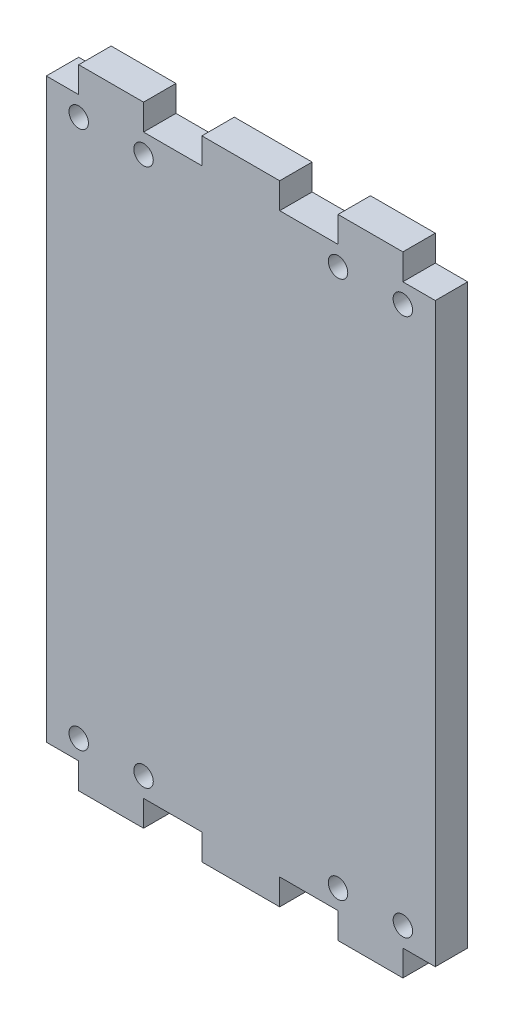
ISO-10303-21;
HEADER;
FILE_DESCRIPTION(('STEP AP214'),'2;1');
FILE_NAME('part.step','',(''),(''),'','','');
FILE_SCHEMA(('AUTOMOTIVE_DESIGN { 1 0 10303 214 1 1 1 1 }'));
ENDSEC;
DATA;
#1=APPLICATION_CONTEXT('core data for automotive mechanical design processes');
#2=APPLICATION_PROTOCOL_DEFINITION('international standard','automotive_design',2000,#1);
#3=PRODUCT_CONTEXT('',#1,'mechanical');
#4=PRODUCT('Part','Part','',(#3));
#5=PRODUCT_RELATED_PRODUCT_CATEGORY('part','',(#4));
#6=PRODUCT_DEFINITION_FORMATION('','',#4);
#7=PRODUCT_DEFINITION_CONTEXT('part definition',#1,'design');
#8=PRODUCT_DEFINITION('design','',#6,#7);
#9=PRODUCT_DEFINITION_SHAPE('','',#8);
#10=(LENGTH_UNIT() NAMED_UNIT(*) SI_UNIT(.MILLI.,.METRE.));
#11=(NAMED_UNIT(*) PLANE_ANGLE_UNIT() SI_UNIT($,.RADIAN.));
#12=(NAMED_UNIT(*) SI_UNIT($,.STERADIAN.) SOLID_ANGLE_UNIT());
#13=UNCERTAINTY_MEASURE_WITH_UNIT(LENGTH_MEASURE(1.E-05),#10,'distance_accuracy_value','');
#14=(GEOMETRIC_REPRESENTATION_CONTEXT(3) GLOBAL_UNCERTAINTY_ASSIGNED_CONTEXT((#13)) GLOBAL_UNIT_ASSIGNED_CONTEXT((#10,
#11,#12)) REPRESENTATION_CONTEXT('',''));
#15=CARTESIAN_POINT('',(0.,0.,0.));
#16=DIRECTION('',(0.,0.,1.));
#17=DIRECTION('',(1.,0.,0.));
#18=AXIS2_PLACEMENT_3D('',#15,#16,#17);
#19=CARTESIAN_POINT('',(30.,48.5,5.));
#20=DIRECTION('',(-1.,0.,0.));
#21=DIRECTION('',(0.,-1.,0.));
#22=AXIS2_PLACEMENT_3D('',#19,#20,#21);
#23=PLANE('',#22);
#24=DIRECTION('',(0.,0.,1.));
#25=VECTOR('',#24,1.);
#26=CARTESIAN_POINT('',(30.,44.5,-5.));
#27=LINE('',#26,#25);
#28=CARTESIAN_POINT('',(30.,44.5,0.));
#29=VERTEX_POINT('',#28);
#30=CARTESIAN_POINT('',(30.,44.5,5.));
#31=VERTEX_POINT('',#30);
#32=EDGE_CURVE('E322',#29,#31,#27,.T.);
#33=ORIENTED_EDGE('',*,*,#32,.T.);
#34=DIRECTION('',(0.,1.,0.));
#35=VECTOR('',#34,1.);
#36=CARTESIAN_POINT('',(30.,48.5,5.));
#37=LINE('',#36,#35);
#38=CARTESIAN_POINT('',(30.,-44.5,5.));
#39=VERTEX_POINT('',#38);
#40=EDGE_CURVE('E364',#39,#31,#37,.T.);
#41=ORIENTED_EDGE('',*,*,#40,.F.);
#42=DIRECTION('',(0.,0.,1.));
#43=VECTOR('',#42,1.);
#44=CARTESIAN_POINT('',(30.,-44.5,-5.));
#45=LINE('',#44,#43);
#46=CARTESIAN_POINT('',(30.,-44.5,0.));
#47=VERTEX_POINT('',#46);
#48=EDGE_CURVE('E325',#47,#39,#45,.T.);
#49=ORIENTED_EDGE('',*,*,#48,.F.);
#50=DIRECTION('',(0.,1.,0.));
#51=VECTOR('',#50,1.);
#52=CARTESIAN_POINT('',(30.,48.5,0.));
#53=LINE('',#52,#51);
#54=EDGE_CURVE('E308',#47,#29,#53,.T.);
#55=ORIENTED_EDGE('',*,*,#54,.T.);
#56=EDGE_LOOP('',(#33,#41,#49,#55));
#57=FACE_BOUND('',#56,.T.);
#58=ADVANCED_FACE('F44',(#57),#23,.F.);
#59=CARTESIAN_POINT('',(-30.,48.5,5.));
#60=DIRECTION('',(0.,-1.,0.));
#61=DIRECTION('',(0.,0.,-1.));
#62=AXIS2_PLACEMENT_3D('',#59,#60,#61);
#63=PLANE('',#62);
#64=DIRECTION('',(0.,0.,1.));
#65=VECTOR('',#64,1.);
#66=CARTESIAN_POINT('',(-6.,48.5,-5.));
#67=LINE('',#66,#65);
#68=CARTESIAN_POINT('',(-6.,48.5,0.));
#69=VERTEX_POINT('',#68);
#70=CARTESIAN_POINT('',(-6.,48.5,5.));
#71=VERTEX_POINT('',#70);
#72=EDGE_CURVE('E305',#69,#71,#67,.T.);
#73=ORIENTED_EDGE('',*,*,#72,.T.);
#74=DIRECTION('',(-1.,0.,0.));
#75=VECTOR('',#74,1.);
#76=CARTESIAN_POINT('',(-30.,48.5,5.));
#77=LINE('',#76,#75);
#78=CARTESIAN_POINT('',(6.,48.5,5.));
#79=VERTEX_POINT('',#78);
#80=EDGE_CURVE('E370',#79,#71,#77,.T.);
#81=ORIENTED_EDGE('',*,*,#80,.F.);
#82=DIRECTION('',(0.,0.,1.));
#83=VECTOR('',#82,1.);
#84=CARTESIAN_POINT('',(6.,48.5,-5.));
#85=LINE('',#84,#83);
#86=CARTESIAN_POINT('',(6.,48.5,0.));
#87=VERTEX_POINT('',#86);
#88=EDGE_CURVE('E309',#87,#79,#85,.T.);
#89=ORIENTED_EDGE('',*,*,#88,.F.);
#90=DIRECTION('',(-1.,0.,0.));
#91=VECTOR('',#90,1.);
#92=CARTESIAN_POINT('',(-30.,48.5,0.));
#93=LINE('',#92,#91);
#94=EDGE_CURVE('E385',#87,#69,#93,.T.);
#95=ORIENTED_EDGE('',*,*,#94,.T.);
#96=EDGE_LOOP('',(#73,#81,#89,#95));
#97=FACE_BOUND('',#96,.T.);
#98=ADVANCED_FACE('F471',(#97),#63,.F.);
#99=DIRECTION('',(0.,0.,1.));
#100=VECTOR('',#99,1.);
#101=CARTESIAN_POINT('',(15.,48.5,-5.));
#102=LINE('',#101,#100);
#103=CARTESIAN_POINT('',(15.,48.5,0.));
#104=VERTEX_POINT('',#103);
#105=CARTESIAN_POINT('',(15.,48.5,5.));
#106=VERTEX_POINT('',#105);
#107=EDGE_CURVE('E315',#104,#106,#102,.T.);
#108=ORIENTED_EDGE('',*,*,#107,.T.);
#109=CARTESIAN_POINT('',(25.,48.5,5.));
#110=VERTEX_POINT('',#109);
#111=EDGE_CURVE('E371',#110,#106,#77,.T.);
#112=ORIENTED_EDGE('',*,*,#111,.F.);
#113=DIRECTION('',(0.,0.,1.));
#114=VECTOR('',#113,1.);
#115=CARTESIAN_POINT('',(25.,48.5,-5.));
#116=LINE('',#115,#114);
#117=CARTESIAN_POINT('',(25.,48.5,0.));
#118=VERTEX_POINT('',#117);
#119=EDGE_CURVE('E318',#118,#110,#116,.T.);
#120=ORIENTED_EDGE('',*,*,#119,.F.);
#121=EDGE_CURVE('E386',#118,#104,#93,.T.);
#122=ORIENTED_EDGE('',*,*,#121,.T.);
#123=EDGE_LOOP('',(#108,#112,#120,#122));
#124=FACE_BOUND('',#123,.T.);
#125=ADVANCED_FACE('F476',(#124),#63,.F.);
#126=DIRECTION('',(0.,0.,1.));
#127=VECTOR('',#126,1.);
#128=CARTESIAN_POINT('',(-25.,48.5,-5.));
#129=LINE('',#128,#127);
#130=CARTESIAN_POINT('',(-25.,48.5,0.));
#131=VERTEX_POINT('',#130);
#132=CARTESIAN_POINT('',(-25.,48.5,5.));
#133=VERTEX_POINT('',#132);
#134=EDGE_CURVE('E68',#131,#133,#129,.T.);
#135=ORIENTED_EDGE('',*,*,#134,.T.);
#136=CARTESIAN_POINT('',(-15.,48.5,5.));
#137=VERTEX_POINT('',#136);
#138=EDGE_CURVE('E367',#137,#133,#77,.T.);
#139=ORIENTED_EDGE('',*,*,#138,.F.);
#140=DIRECTION('',(0.,0.,1.));
#141=VECTOR('',#140,1.);
#142=CARTESIAN_POINT('',(-15.,48.5,-5.));
#143=LINE('',#142,#141);
#144=CARTESIAN_POINT('',(-15.,48.5,0.));
#145=VERTEX_POINT('',#144);
#146=EDGE_CURVE('E237',#145,#137,#143,.T.);
#147=ORIENTED_EDGE('',*,*,#146,.F.);
#148=EDGE_CURVE('E382',#145,#131,#93,.T.);
#149=ORIENTED_EDGE('',*,*,#148,.T.);
#150=EDGE_LOOP('',(#135,#139,#147,#149));
#151=FACE_BOUND('',#150,.T.);
#152=ADVANCED_FACE('F478',(#151),#63,.F.);
#153=CARTESIAN_POINT('',(-30.,48.5,5.));
#154=DIRECTION('',(1.,0.,0.));
#155=DIRECTION('',(0.,1.,0.));
#156=AXIS2_PLACEMENT_3D('',#153,#154,#155);
#157=PLANE('',#156);
#158=DIRECTION('',(0.,0.,1.));
#159=VECTOR('',#158,1.);
#160=CARTESIAN_POINT('',(-30.,-44.5,-5.));
#161=LINE('',#160,#159);
#162=CARTESIAN_POINT('',(-30.,-44.5,0.));
#163=VERTEX_POINT('',#162);
#164=CARTESIAN_POINT('',(-30.,-44.5,5.));
#165=VERTEX_POINT('',#164);
#166=EDGE_CURVE('E354',#163,#165,#161,.T.);
#167=ORIENTED_EDGE('',*,*,#166,.T.);
#168=DIRECTION('',(0.,-1.,0.));
#169=VECTOR('',#168,1.);
#170=CARTESIAN_POINT('',(-30.,48.5,5.));
#171=LINE('',#170,#169);
#172=CARTESIAN_POINT('',(-30.,44.5,5.));
#173=VERTEX_POINT('',#172);
#174=EDGE_CURVE('E372',#173,#165,#171,.T.);
#175=ORIENTED_EDGE('',*,*,#174,.F.);
#176=DIRECTION('',(0.,0.,1.));
#177=VECTOR('',#176,1.);
#178=CARTESIAN_POINT('',(-30.,44.5,-5.));
#179=LINE('',#178,#177);
#180=CARTESIAN_POINT('',(-30.,44.5,0.));
#181=VERTEX_POINT('',#180);
#182=EDGE_CURVE('E357',#181,#173,#179,.T.);
#183=ORIENTED_EDGE('',*,*,#182,.F.);
#184=DIRECTION('',(0.,-1.,0.));
#185=VECTOR('',#184,1.);
#186=CARTESIAN_POINT('',(-30.,48.5,0.));
#187=LINE('',#186,#185);
#188=EDGE_CURVE('E387',#181,#163,#187,.T.);
#189=ORIENTED_EDGE('',*,*,#188,.T.);
#190=EDGE_LOOP('',(#167,#175,#183,#189));
#191=FACE_BOUND('',#190,.T.);
#192=ADVANCED_FACE('F524',(#191),#157,.F.);
#193=CARTESIAN_POINT('',(-30.,-48.5,5.));
#194=DIRECTION('',(0.,1.,0.));
#195=DIRECTION('',(0.,0.,1.));
#196=AXIS2_PLACEMENT_3D('',#193,#194,#195);
#197=PLANE('',#196);
#198=DIRECTION('',(0.,0.,1.));
#199=VECTOR('',#198,1.);
#200=CARTESIAN_POINT('',(25.,-48.5,-5.));
#201=LINE('',#200,#199);
#202=CARTESIAN_POINT('',(25.,-48.5,0.));
#203=VERTEX_POINT('',#202);
#204=CARTESIAN_POINT('',(25.,-48.5,5.));
#205=VERTEX_POINT('',#204);
#206=EDGE_CURVE('E329',#203,#205,#201,.T.);
#207=ORIENTED_EDGE('',*,*,#206,.T.);
#208=DIRECTION('',(1.,0.,0.));
#209=VECTOR('',#208,1.);
#210=CARTESIAN_POINT('',(-30.,-48.5,5.));
#211=LINE('',#210,#209);
#212=CARTESIAN_POINT('',(15.,-48.5,5.));
#213=VERTEX_POINT('',#212);
#214=EDGE_CURVE('E375',#213,#205,#211,.T.);
#215=ORIENTED_EDGE('',*,*,#214,.F.);
#216=DIRECTION('',(0.,0.,1.));
#217=VECTOR('',#216,1.);
#218=CARTESIAN_POINT('',(15.,-48.5,-5.));
#219=LINE('',#218,#217);
#220=CARTESIAN_POINT('',(15.,-48.5,0.));
#221=VERTEX_POINT('',#220);
#222=EDGE_CURVE('E332',#221,#213,#219,.T.);
#223=ORIENTED_EDGE('',*,*,#222,.F.);
#224=DIRECTION('',(1.,0.,0.));
#225=VECTOR('',#224,1.);
#226=CARTESIAN_POINT('',(-30.,-48.5,0.));
#227=LINE('',#226,#225);
#228=EDGE_CURVE('E390',#221,#203,#227,.T.);
#229=ORIENTED_EDGE('',*,*,#228,.T.);
#230=EDGE_LOOP('',(#207,#215,#223,#229));
#231=FACE_BOUND('',#230,.T.);
#232=ADVANCED_FACE('F566',(#231),#197,.F.);
#233=DIRECTION('',(0.,0.,1.));
#234=VECTOR('',#233,1.);
#235=CARTESIAN_POINT('',(6.,-48.5,-5.));
#236=LINE('',#235,#234);
#237=CARTESIAN_POINT('',(6.,-48.5,0.));
#238=VERTEX_POINT('',#237);
#239=CARTESIAN_POINT('',(6.,-48.5,5.));
#240=VERTEX_POINT('',#239);
#241=EDGE_CURVE('E338',#238,#240,#236,.T.);
#242=ORIENTED_EDGE('',*,*,#241,.T.);
#243=CARTESIAN_POINT('',(-6.,-48.5,5.));
#244=VERTEX_POINT('',#243);
#245=EDGE_CURVE('E378',#244,#240,#211,.T.);
#246=ORIENTED_EDGE('',*,*,#245,.F.);
#247=DIRECTION('',(0.,0.,1.));
#248=VECTOR('',#247,1.);
#249=CARTESIAN_POINT('',(-6.,-48.5,-5.));
#250=LINE('',#249,#248);
#251=CARTESIAN_POINT('',(-6.,-48.5,0.));
#252=VERTEX_POINT('',#251);
#253=EDGE_CURVE('E341',#252,#244,#250,.T.);
#254=ORIENTED_EDGE('',*,*,#253,.F.);
#255=EDGE_CURVE('E393',#252,#238,#227,.T.);
#256=ORIENTED_EDGE('',*,*,#255,.T.);
#257=EDGE_LOOP('',(#242,#246,#254,#256));
#258=FACE_BOUND('',#257,.T.);
#259=ADVANCED_FACE('F545',(#258),#197,.F.);
#260=DIRECTION('',(0.,0.,1.));
#261=VECTOR('',#260,1.);
#262=CARTESIAN_POINT('',(-15.,-48.5,-5.));
#263=LINE('',#262,#261);
#264=CARTESIAN_POINT('',(-15.,-48.5,0.));
#265=VERTEX_POINT('',#264);
#266=CARTESIAN_POINT('',(-15.,-48.5,5.));
#267=VERTEX_POINT('',#266);
#268=EDGE_CURVE('E347',#265,#267,#263,.T.);
#269=ORIENTED_EDGE('',*,*,#268,.T.);
#270=CARTESIAN_POINT('',(-25.,-48.5,5.));
#271=VERTEX_POINT('',#270);
#272=EDGE_CURVE('E379',#271,#267,#211,.T.);
#273=ORIENTED_EDGE('',*,*,#272,.F.);
#274=DIRECTION('',(0.,0.,1.));
#275=VECTOR('',#274,1.);
#276=CARTESIAN_POINT('',(-25.,-48.5,-5.));
#277=LINE('',#276,#275);
#278=CARTESIAN_POINT('',(-25.,-48.5,0.));
#279=VERTEX_POINT('',#278);
#280=EDGE_CURVE('E350',#279,#271,#277,.T.);
#281=ORIENTED_EDGE('',*,*,#280,.F.);
#282=EDGE_CURVE('E368',#279,#265,#227,.T.);
#283=ORIENTED_EDGE('',*,*,#282,.T.);
#284=EDGE_LOOP('',(#269,#273,#281,#283));
#285=FACE_BOUND('',#284,.T.);
#286=ADVANCED_FACE('F538',(#285),#197,.F.);
#287=CARTESIAN_POINT('',(0.,0.,5.));
#288=DIRECTION('',(0.,0.,1.));
#289=DIRECTION('',(1.,0.,0.));
#290=AXIS2_PLACEMENT_3D('',#287,#288,#289);
#291=PLANE('',#290);
#292=CARTESIAN_POINT('',(-15.0000012437886,41.5049875614917,5.));
#293=DIRECTION('',(0.,0.,1.));
#294=DIRECTION('',(1.,0.,0.));
#295=AXIS2_PLACEMENT_3D('',#292,#293,#294);
#296=CIRCLE('',#295,1.5);
#297=CARTESIAN_POINT('',(-13.5000012437886,41.5049875614917,5.));
#298=VERTEX_POINT('',#297);
#299=EDGE_CURVE('E906',#298,#298,#296,.T.);
#300=ORIENTED_EDGE('',*,*,#299,.F.);
#301=EDGE_LOOP('',(#300));
#302=FACE_BOUND('',#301,.T.);
#303=CARTESIAN_POINT('',(15.0000012437886,41.5049875614917,5.));
#304=DIRECTION('',(0.,0.,1.));
#305=DIRECTION('',(-1.,0.,0.));
#306=AXIS2_PLACEMENT_3D('',#303,#304,#305);
#307=CIRCLE('',#306,1.5);
#308=CARTESIAN_POINT('',(13.5000012437886,41.5049875614917,5.));
#309=VERTEX_POINT('',#308);
#310=EDGE_CURVE('E902',#309,#309,#307,.T.);
#311=ORIENTED_EDGE('',*,*,#310,.F.);
#312=EDGE_LOOP('',(#311));
#313=FACE_BOUND('',#312,.T.);
#314=CARTESIAN_POINT('',(25.,41.5,5.));
#315=DIRECTION('',(0.,0.,1.));
#316=DIRECTION('',(-1.,0.,0.));
#317=AXIS2_PLACEMENT_3D('',#314,#315,#316);
#318=CIRCLE('',#317,1.5);
#319=CARTESIAN_POINT('',(23.5,41.5,5.));
#320=VERTEX_POINT('',#319);
#321=EDGE_CURVE('E883',#320,#320,#318,.T.);
#322=ORIENTED_EDGE('',*,*,#321,.F.);
#323=EDGE_LOOP('',(#322));
#324=FACE_BOUND('',#323,.T.);
#325=CARTESIAN_POINT('',(25.,-41.5,5.));
#326=DIRECTION('',(0.,0.,1.));
#327=DIRECTION('',(1.,0.,0.));
#328=AXIS2_PLACEMENT_3D('',#325,#326,#327);
#329=CIRCLE('',#328,1.5);
#330=CARTESIAN_POINT('',(26.5,-41.5,5.));
#331=VERTEX_POINT('',#330);
#332=EDGE_CURVE('E903',#331,#331,#329,.T.);
#333=ORIENTED_EDGE('',*,*,#332,.F.);
#334=EDGE_LOOP('',(#333));
#335=FACE_BOUND('',#334,.T.);
#336=CARTESIAN_POINT('',(15.0000012437886,-41.5049875614917,5.));
#337=DIRECTION('',(0.,0.,1.));
#338=DIRECTION('',(1.,0.,0.));
#339=AXIS2_PLACEMENT_3D('',#336,#337,#338);
#340=CIRCLE('',#339,1.5);
#341=CARTESIAN_POINT('',(16.5000012437886,-41.5049875614917,5.));
#342=VERTEX_POINT('',#341);
#343=EDGE_CURVE('E909',#342,#342,#340,.T.);
#344=ORIENTED_EDGE('',*,*,#343,.F.);
#345=EDGE_LOOP('',(#344));
#346=FACE_BOUND('',#345,.T.);
#347=CARTESIAN_POINT('',(-15.0000012437886,-41.5049875614917,5.));
#348=DIRECTION('',(0.,0.,1.));
#349=DIRECTION('',(-1.,0.,0.));
#350=AXIS2_PLACEMENT_3D('',#347,#348,#349);
#351=CIRCLE('',#350,1.5);
#352=CARTESIAN_POINT('',(-16.5000012437886,-41.5049875614917,5.));
#353=VERTEX_POINT('',#352);
#354=EDGE_CURVE('E919',#353,#353,#351,.T.);
#355=ORIENTED_EDGE('',*,*,#354,.F.);
#356=EDGE_LOOP('',(#355));
#357=FACE_BOUND('',#356,.T.);
#358=CARTESIAN_POINT('',(-25.,-41.5,5.));
#359=DIRECTION('',(0.,0.,1.));
#360=DIRECTION('',(-1.,0.,0.));
#361=AXIS2_PLACEMENT_3D('',#358,#359,#360);
#362=CIRCLE('',#361,1.5);
#363=CARTESIAN_POINT('',(-26.5,-41.5,5.));
#364=VERTEX_POINT('',#363);
#365=EDGE_CURVE('E916',#364,#364,#362,.T.);
#366=ORIENTED_EDGE('',*,*,#365,.F.);
#367=EDGE_LOOP('',(#366));
#368=FACE_BOUND('',#367,.T.);
#369=CARTESIAN_POINT('',(-25.,41.5,5.));
#370=DIRECTION('',(0.,0.,1.));
#371=DIRECTION('',(1.,0.,0.));
#372=AXIS2_PLACEMENT_3D('',#369,#370,#371);
#373=CIRCLE('',#372,1.5);
#374=CARTESIAN_POINT('',(-23.5,41.5,5.));
#375=VERTEX_POINT('',#374);
#376=EDGE_CURVE('E434',#375,#375,#373,.T.);
#377=ORIENTED_EDGE('',*,*,#376,.F.);
#378=EDGE_LOOP('',(#377));
#379=FACE_BOUND('',#378,.T.);
#380=DIRECTION('',(-1.,0.,0.));
#381=VECTOR('',#380,1.);
#382=CARTESIAN_POINT('',(6.,44.5,5.));
#383=LINE('',#382,#381);
#384=CARTESIAN_POINT('',(15.,44.5,5.));
#385=VERTEX_POINT('',#384);
#386=CARTESIAN_POINT('',(6.,44.5,5.));
#387=VERTEX_POINT('',#386);
#388=EDGE_CURVE('E300',#385,#387,#383,.T.);
#389=ORIENTED_EDGE('',*,*,#388,.T.);
#390=DIRECTION('',(0.,1.,0.));
#391=VECTOR('',#390,1.);
#392=CARTESIAN_POINT('',(6.,44.5,5.));
#393=LINE('',#392,#391);
#394=EDGE_CURVE('E302',#387,#79,#393,.T.);
#395=ORIENTED_EDGE('',*,*,#394,.T.);
#396=ORIENTED_EDGE('',*,*,#80,.T.);
#397=DIRECTION('',(0.,-1.,0.));
#398=VECTOR('',#397,1.);
#399=CARTESIAN_POINT('',(-6.,48.5,5.));
#400=LINE('',#399,#398);
#401=CARTESIAN_POINT('',(-6.,44.5,5.));
#402=VERTEX_POINT('',#401);
#403=EDGE_CURVE('E251',#71,#402,#400,.T.);
#404=ORIENTED_EDGE('',*,*,#403,.T.);
#405=DIRECTION('',(-1.,0.,0.));
#406=VECTOR('',#405,1.);
#407=CARTESIAN_POINT('',(-6.,44.5,5.));
#408=LINE('',#407,#406);
#409=CARTESIAN_POINT('',(-15.,44.5,5.));
#410=VERTEX_POINT('',#409);
#411=EDGE_CURVE('E231',#402,#410,#408,.T.);
#412=ORIENTED_EDGE('',*,*,#411,.T.);
#413=DIRECTION('',(0.,1.,0.));
#414=VECTOR('',#413,1.);
#415=CARTESIAN_POINT('',(-15.,44.5,5.));
#416=LINE('',#415,#414);
#417=EDGE_CURVE('E240',#410,#137,#416,.T.);
#418=ORIENTED_EDGE('',*,*,#417,.T.);
#419=ORIENTED_EDGE('',*,*,#138,.T.);
#420=DIRECTION('',(0.,-1.,0.));
#421=VECTOR('',#420,1.);
#422=CARTESIAN_POINT('',(-25.,48.5,5.));
#423=LINE('',#422,#421);
#424=CARTESIAN_POINT('',(-25.,44.5,5.));
#425=VERTEX_POINT('',#424);
#426=EDGE_CURVE('E246',#133,#425,#423,.T.);
#427=ORIENTED_EDGE('',*,*,#426,.T.);
#428=DIRECTION('',(-1.,0.,0.));
#429=VECTOR('',#428,1.);
#430=CARTESIAN_POINT('',(-25.,44.5,5.));
#431=LINE('',#430,#429);
#432=EDGE_CURVE('E258',#425,#173,#431,.T.);
#433=ORIENTED_EDGE('',*,*,#432,.T.);
#434=ORIENTED_EDGE('',*,*,#174,.T.);
#435=DIRECTION('',(1.,0.,0.));
#436=VECTOR('',#435,1.);
#437=CARTESIAN_POINT('',(-25.,-44.5,5.));
#438=LINE('',#437,#436);
#439=CARTESIAN_POINT('',(-25.,-44.5,5.));
#440=VERTEX_POINT('',#439);
#441=EDGE_CURVE('E261',#165,#440,#438,.T.);
#442=ORIENTED_EDGE('',*,*,#441,.T.);
#443=DIRECTION('',(0.,-1.,0.));
#444=VECTOR('',#443,1.);
#445=CARTESIAN_POINT('',(-25.,-48.5,5.));
#446=LINE('',#445,#444);
#447=EDGE_CURVE('E264',#440,#271,#446,.T.);
#448=ORIENTED_EDGE('',*,*,#447,.T.);
#449=ORIENTED_EDGE('',*,*,#272,.T.);
#450=DIRECTION('',(0.,1.,0.));
#451=VECTOR('',#450,1.);
#452=CARTESIAN_POINT('',(-15.,-44.5,5.));
#453=LINE('',#452,#451);
#454=CARTESIAN_POINT('',(-15.,-44.5,5.));
#455=VERTEX_POINT('',#454);
#456=EDGE_CURVE('E267',#267,#455,#453,.T.);
#457=ORIENTED_EDGE('',*,*,#456,.T.);
#458=DIRECTION('',(1.,0.,0.));
#459=VECTOR('',#458,1.);
#460=CARTESIAN_POINT('',(-6.,-44.5,5.));
#461=LINE('',#460,#459);
#462=CARTESIAN_POINT('',(-6.,-44.5,5.));
#463=VERTEX_POINT('',#462);
#464=EDGE_CURVE('E270',#455,#463,#461,.T.);
#465=ORIENTED_EDGE('',*,*,#464,.T.);
#466=DIRECTION('',(0.,-1.,0.));
#467=VECTOR('',#466,1.);
#468=CARTESIAN_POINT('',(-6.,-48.5,5.));
#469=LINE('',#468,#467);
#470=EDGE_CURVE('E273',#463,#244,#469,.T.);
#471=ORIENTED_EDGE('',*,*,#470,.T.);
#472=ORIENTED_EDGE('',*,*,#245,.T.);
#473=DIRECTION('',(0.,1.,0.));
#474=VECTOR('',#473,1.);
#475=CARTESIAN_POINT('',(6.,-44.5,5.));
#476=LINE('',#475,#474);
#477=CARTESIAN_POINT('',(6.,-44.5,5.));
#478=VERTEX_POINT('',#477);
#479=EDGE_CURVE('E276',#240,#478,#476,.T.);
#480=ORIENTED_EDGE('',*,*,#479,.T.);
#481=DIRECTION('',(1.,0.,0.));
#482=VECTOR('',#481,1.);
#483=CARTESIAN_POINT('',(6.,-44.5,5.));
#484=LINE('',#483,#482);
#485=CARTESIAN_POINT('',(15.,-44.5,5.));
#486=VERTEX_POINT('',#485);
#487=EDGE_CURVE('E279',#478,#486,#484,.T.);
#488=ORIENTED_EDGE('',*,*,#487,.T.);
#489=DIRECTION('',(0.,-1.,0.));
#490=VECTOR('',#489,1.);
#491=CARTESIAN_POINT('',(15.,-44.5,5.));
#492=LINE('',#491,#490);
#493=EDGE_CURVE('E282',#486,#213,#492,.T.);
#494=ORIENTED_EDGE('',*,*,#493,.T.);
#495=ORIENTED_EDGE('',*,*,#214,.T.);
#496=DIRECTION('',(0.,1.,0.));
#497=VECTOR('',#496,1.);
#498=CARTESIAN_POINT('',(25.,-48.5,5.));
#499=LINE('',#498,#497);
#500=CARTESIAN_POINT('',(25.,-44.5,5.));
#501=VERTEX_POINT('',#500);
#502=EDGE_CURVE('E285',#205,#501,#499,.T.);
#503=ORIENTED_EDGE('',*,*,#502,.T.);
#504=DIRECTION('',(1.,0.,0.));
#505=VECTOR('',#504,1.);
#506=CARTESIAN_POINT('',(25.,-44.5,5.));
#507=LINE('',#506,#505);
#508=EDGE_CURVE('E288',#501,#39,#507,.T.);
#509=ORIENTED_EDGE('',*,*,#508,.T.);
#510=ORIENTED_EDGE('',*,*,#40,.T.);
#511=DIRECTION('',(-1.,0.,0.));
#512=VECTOR('',#511,1.);
#513=CARTESIAN_POINT('',(25.,44.5,5.));
#514=LINE('',#513,#512);
#515=CARTESIAN_POINT('',(25.,44.5,5.));
#516=VERTEX_POINT('',#515);
#517=EDGE_CURVE('E291',#31,#516,#514,.T.);
#518=ORIENTED_EDGE('',*,*,#517,.T.);
#519=DIRECTION('',(0.,1.,0.));
#520=VECTOR('',#519,1.);
#521=CARTESIAN_POINT('',(25.,48.5,5.));
#522=LINE('',#521,#520);
#523=EDGE_CURVE('E294',#516,#110,#522,.T.);
#524=ORIENTED_EDGE('',*,*,#523,.T.);
#525=ORIENTED_EDGE('',*,*,#111,.T.);
#526=DIRECTION('',(0.,-1.,0.));
#527=VECTOR('',#526,1.);
#528=CARTESIAN_POINT('',(15.,44.5,5.));
#529=LINE('',#528,#527);
#530=EDGE_CURVE('E297',#106,#385,#529,.T.);
#531=ORIENTED_EDGE('',*,*,#530,.T.);
#532=EDGE_LOOP('',(#389,#395,#396,#404,#412,#418,#419,#427,#433,#434,#442,#448,#449,#457,#465,
#471,#472,#480,#488,#494,#495,#503,#509,#510,#518,#524,#525,#531));
#533=FACE_BOUND('',#532,.T.);
#534=ADVANCED_FACE('F249',(#302,#313,#324,#335,#346,#357,#368,#379,#533),#291,.T.);
#535=CARTESIAN_POINT('',(0.,0.,0.));
#536=DIRECTION('',(0.,0.,1.));
#537=DIRECTION('',(1.,0.,0.));
#538=AXIS2_PLACEMENT_3D('',#535,#536,#537);
#539=PLANE('',#538);
#540=CARTESIAN_POINT('',(-15.0000012437886,41.5049875614917,0.));
#541=DIRECTION('',(0.,0.,1.));
#542=DIRECTION('',(1.,0.,0.));
#543=AXIS2_PLACEMENT_3D('',#540,#541,#542);
#544=CIRCLE('',#543,1.5);
#545=CARTESIAN_POINT('',(-13.5000012437886,41.5049875614917,0.));
#546=VERTEX_POINT('',#545);
#547=EDGE_CURVE('E47',#546,#546,#544,.T.);
#548=ORIENTED_EDGE('',*,*,#547,.T.);
#549=EDGE_LOOP('',(#548));
#550=FACE_BOUND('',#549,.T.);
#551=CARTESIAN_POINT('',(15.0000012437886,41.5049875614917,0.));
#552=DIRECTION('',(0.,0.,1.));
#553=DIRECTION('',(1.,0.,0.));
#554=AXIS2_PLACEMENT_3D('',#551,#552,#553);
#555=CIRCLE('',#554,1.5);
#556=CARTESIAN_POINT('',(16.5000012437886,41.5049875614917,0.));
#557=VERTEX_POINT('',#556);
#558=EDGE_CURVE('E448',#557,#557,#555,.T.);
#559=ORIENTED_EDGE('',*,*,#558,.T.);
#560=EDGE_LOOP('',(#559));
#561=FACE_BOUND('',#560,.T.);
#562=CARTESIAN_POINT('',(25.,41.5,0.));
#563=DIRECTION('',(0.,0.,1.));
#564=DIRECTION('',(1.,0.,0.));
#565=AXIS2_PLACEMENT_3D('',#562,#563,#564);
#566=CIRCLE('',#565,1.5);
#567=CARTESIAN_POINT('',(26.5,41.5,0.));
#568=VERTEX_POINT('',#567);
#569=EDGE_CURVE('E446',#568,#568,#566,.T.);
#570=ORIENTED_EDGE('',*,*,#569,.T.);
#571=EDGE_LOOP('',(#570));
#572=FACE_BOUND('',#571,.T.);
#573=CARTESIAN_POINT('',(25.,-41.5,0.));
#574=DIRECTION('',(0.,0.,1.));
#575=DIRECTION('',(1.,0.,0.));
#576=AXIS2_PLACEMENT_3D('',#573,#574,#575);
#577=CIRCLE('',#576,1.5);
#578=CARTESIAN_POINT('',(26.5,-41.5,0.));
#579=VERTEX_POINT('',#578);
#580=EDGE_CURVE('E443',#579,#579,#577,.T.);
#581=ORIENTED_EDGE('',*,*,#580,.T.);
#582=EDGE_LOOP('',(#581));
#583=FACE_BOUND('',#582,.T.);
#584=CARTESIAN_POINT('',(15.0000012437886,-41.5049875614917,0.));
#585=DIRECTION('',(0.,0.,1.));
#586=DIRECTION('',(1.,0.,0.));
#587=AXIS2_PLACEMENT_3D('',#584,#585,#586);
#588=CIRCLE('',#587,1.5);
#589=CARTESIAN_POINT('',(16.5000012437886,-41.5049875614917,0.));
#590=VERTEX_POINT('',#589);
#591=EDGE_CURVE('E440',#590,#590,#588,.T.);
#592=ORIENTED_EDGE('',*,*,#591,.T.);
#593=EDGE_LOOP('',(#592));
#594=FACE_BOUND('',#593,.T.);
#595=CARTESIAN_POINT('',(-15.0000012437886,-41.5049875614917,0.));
#596=DIRECTION('',(0.,0.,1.));
#597=DIRECTION('',(1.,0.,0.));
#598=AXIS2_PLACEMENT_3D('',#595,#596,#597);
#599=CIRCLE('',#598,1.5);
#600=CARTESIAN_POINT('',(-13.5000012437886,-41.5049875614917,0.));
#601=VERTEX_POINT('',#600);
#602=EDGE_CURVE('E437',#601,#601,#599,.T.);
#603=ORIENTED_EDGE('',*,*,#602,.T.);
#604=EDGE_LOOP('',(#603));
#605=FACE_BOUND('',#604,.T.);
#606=CARTESIAN_POINT('',(-25.,-41.5,0.));
#607=DIRECTION('',(0.,0.,1.));
#608=DIRECTION('',(1.,0.,0.));
#609=AXIS2_PLACEMENT_3D('',#606,#607,#608);
#610=CIRCLE('',#609,1.5);
#611=CARTESIAN_POINT('',(-23.5,-41.5,0.));
#612=VERTEX_POINT('',#611);
#613=EDGE_CURVE('E433',#612,#612,#610,.T.);
#614=ORIENTED_EDGE('',*,*,#613,.T.);
#615=EDGE_LOOP('',(#614));
#616=FACE_BOUND('',#615,.T.);
#617=CARTESIAN_POINT('',(-25.,41.5,0.));
#618=DIRECTION('',(0.,0.,1.));
#619=DIRECTION('',(1.,0.,0.));
#620=AXIS2_PLACEMENT_3D('',#617,#618,#619);
#621=CIRCLE('',#620,1.5);
#622=CARTESIAN_POINT('',(-23.5,41.5,0.));
#623=VERTEX_POINT('',#622);
#624=EDGE_CURVE('E430',#623,#623,#621,.T.);
#625=ORIENTED_EDGE('',*,*,#624,.T.);
#626=EDGE_LOOP('',(#625));
#627=FACE_BOUND('',#626,.T.);
#628=DIRECTION('',(0.,1.,0.));
#629=VECTOR('',#628,1.);
#630=CARTESIAN_POINT('',(6.,0.,0.));
#631=LINE('',#630,#629);
#632=CARTESIAN_POINT('',(6.,44.5,0.));
#633=VERTEX_POINT('',#632);
#634=EDGE_CURVE('E13',#633,#87,#631,.T.);
#635=ORIENTED_EDGE('',*,*,#634,.F.);
#636=DIRECTION('',(-1.,0.,0.));
#637=VECTOR('',#636,1.);
#638=CARTESIAN_POINT('',(0.,44.5,0.));
#639=LINE('',#638,#637);
#640=CARTESIAN_POINT('',(15.,44.5,0.));
#641=VERTEX_POINT('',#640);
#642=EDGE_CURVE('E52',#641,#633,#639,.T.);
#643=ORIENTED_EDGE('',*,*,#642,.F.);
#644=DIRECTION('',(0.,-1.,0.));
#645=VECTOR('',#644,1.);
#646=CARTESIAN_POINT('',(15.,0.,0.));
#647=LINE('',#646,#645);
#648=EDGE_CURVE('E427',#104,#641,#647,.T.);
#649=ORIENTED_EDGE('',*,*,#648,.F.);
#650=ORIENTED_EDGE('',*,*,#121,.F.);
#651=DIRECTION('',(0.,1.,0.));
#652=VECTOR('',#651,1.);
#653=CARTESIAN_POINT('',(25.,0.,0.));
#654=LINE('',#653,#652);
#655=CARTESIAN_POINT('',(25.,44.5,0.));
#656=VERTEX_POINT('',#655);
#657=EDGE_CURVE('E425',#656,#118,#654,.T.);
#658=ORIENTED_EDGE('',*,*,#657,.F.);
#659=DIRECTION('',(-1.,0.,0.));
#660=VECTOR('',#659,1.);
#661=CARTESIAN_POINT('',(1.85268467234324E-13,44.5000000000001,0.));
#662=LINE('',#661,#660);
#663=EDGE_CURVE('E423',#29,#656,#662,.T.);
#664=ORIENTED_EDGE('',*,*,#663,.F.);
#665=ORIENTED_EDGE('',*,*,#54,.F.);
#666=DIRECTION('',(1.,0.,0.));
#667=VECTOR('',#666,1.);
#668=CARTESIAN_POINT('',(1.85268467234324E-13,-44.5000000000001,0.));
#669=LINE('',#668,#667);
#670=CARTESIAN_POINT('',(25.,-44.5,0.));
#671=VERTEX_POINT('',#670);
#672=EDGE_CURVE('E421',#671,#47,#669,.T.);
#673=ORIENTED_EDGE('',*,*,#672,.F.);
#674=DIRECTION('',(0.,1.,0.));
#675=VECTOR('',#674,1.);
#676=CARTESIAN_POINT('',(25.,0.,0.));
#677=LINE('',#676,#675);
#678=EDGE_CURVE('E419',#203,#671,#677,.T.);
#679=ORIENTED_EDGE('',*,*,#678,.F.);
#680=ORIENTED_EDGE('',*,*,#228,.F.);
#681=DIRECTION('',(0.,-1.,0.));
#682=VECTOR('',#681,1.);
#683=CARTESIAN_POINT('',(15.,0.,0.));
#684=LINE('',#683,#682);
#685=CARTESIAN_POINT('',(15.,-44.5,0.));
#686=VERTEX_POINT('',#685);
#687=EDGE_CURVE('E417',#686,#221,#684,.T.);
#688=ORIENTED_EDGE('',*,*,#687,.F.);
#689=DIRECTION('',(1.,0.,0.));
#690=VECTOR('',#689,1.);
#691=CARTESIAN_POINT('',(0.,-44.5,0.));
#692=LINE('',#691,#690);
#693=CARTESIAN_POINT('',(6.,-44.5,0.));
#694=VERTEX_POINT('',#693);
#695=EDGE_CURVE('E415',#694,#686,#692,.T.);
#696=ORIENTED_EDGE('',*,*,#695,.F.);
#697=DIRECTION('',(0.,1.,0.));
#698=VECTOR('',#697,1.);
#699=CARTESIAN_POINT('',(6.,0.,0.));
#700=LINE('',#699,#698);
#701=EDGE_CURVE('E413',#238,#694,#700,.T.);
#702=ORIENTED_EDGE('',*,*,#701,.F.);
#703=ORIENTED_EDGE('',*,*,#255,.F.);
#704=DIRECTION('',(0.,-1.,0.));
#705=VECTOR('',#704,1.);
#706=CARTESIAN_POINT('',(-5.99999999999999,0.,0.));
#707=LINE('',#706,#705);
#708=CARTESIAN_POINT('',(-6.,-44.5,0.));
#709=VERTEX_POINT('',#708);
#710=EDGE_CURVE('E411',#709,#252,#707,.T.);
#711=ORIENTED_EDGE('',*,*,#710,.F.);
#712=DIRECTION('',(1.,0.,0.));
#713=VECTOR('',#712,1.);
#714=CARTESIAN_POINT('',(0.,-44.5,0.));
#715=LINE('',#714,#713);
#716=CARTESIAN_POINT('',(-15.,-44.5,0.));
#717=VERTEX_POINT('',#716);
#718=EDGE_CURVE('E409',#717,#709,#715,.T.);
#719=ORIENTED_EDGE('',*,*,#718,.F.);
#720=DIRECTION('',(0.,1.,0.));
#721=VECTOR('',#720,1.);
#722=CARTESIAN_POINT('',(-15.,0.,0.));
#723=LINE('',#722,#721);
#724=EDGE_CURVE('E407',#265,#717,#723,.T.);
#725=ORIENTED_EDGE('',*,*,#724,.F.);
#726=ORIENTED_EDGE('',*,*,#282,.F.);
#727=DIRECTION('',(0.,-1.,0.));
#728=VECTOR('',#727,1.);
#729=CARTESIAN_POINT('',(-25.,0.,0.));
#730=LINE('',#729,#728);
#731=CARTESIAN_POINT('',(-25.,-44.5,0.));
#732=VERTEX_POINT('',#731);
#733=EDGE_CURVE('E405',#732,#279,#730,.T.);
#734=ORIENTED_EDGE('',*,*,#733,.F.);
#735=DIRECTION('',(1.,0.,0.));
#736=VECTOR('',#735,1.);
#737=CARTESIAN_POINT('',(0.,-44.5,0.));
#738=LINE('',#737,#736);
#739=EDGE_CURVE('E403',#163,#732,#738,.T.);
#740=ORIENTED_EDGE('',*,*,#739,.F.);
#741=ORIENTED_EDGE('',*,*,#188,.F.);
#742=DIRECTION('',(-1.,0.,0.));
#743=VECTOR('',#742,1.);
#744=CARTESIAN_POINT('',(0.,44.5,0.));
#745=LINE('',#744,#743);
#746=CARTESIAN_POINT('',(-25.,44.5,0.));
#747=VERTEX_POINT('',#746);
#748=EDGE_CURVE('E401',#747,#181,#745,.T.);
#749=ORIENTED_EDGE('',*,*,#748,.F.);
#750=DIRECTION('',(0.,-1.,0.));
#751=VECTOR('',#750,1.);
#752=CARTESIAN_POINT('',(-25.,0.,0.));
#753=LINE('',#752,#751);
#754=EDGE_CURVE('E399',#131,#747,#753,.T.);
#755=ORIENTED_EDGE('',*,*,#754,.F.);
#756=ORIENTED_EDGE('',*,*,#148,.F.);
#757=DIRECTION('',(0.,1.,0.));
#758=VECTOR('',#757,1.);
#759=CARTESIAN_POINT('',(-15.,0.,0.));
#760=LINE('',#759,#758);
#761=CARTESIAN_POINT('',(-15.,44.5,0.));
#762=VERTEX_POINT('',#761);
#763=EDGE_CURVE('E395',#762,#145,#760,.T.);
#764=ORIENTED_EDGE('',*,*,#763,.F.);
#765=DIRECTION('',(-1.,0.,0.));
#766=VECTOR('',#765,1.);
#767=CARTESIAN_POINT('',(0.,44.5,0.));
#768=LINE('',#767,#766);
#769=CARTESIAN_POINT('',(-6.,44.5,0.));
#770=VERTEX_POINT('',#769);
#771=EDGE_CURVE('E234',#770,#762,#768,.T.);
#772=ORIENTED_EDGE('',*,*,#771,.F.);
#773=DIRECTION('',(0.,-1.,0.));
#774=VECTOR('',#773,1.);
#775=CARTESIAN_POINT('',(-5.99999999999999,0.,0.));
#776=LINE('',#775,#774);
#777=EDGE_CURVE('E397',#69,#770,#776,.T.);
#778=ORIENTED_EDGE('',*,*,#777,.F.);
#779=ORIENTED_EDGE('',*,*,#94,.F.);
#780=EDGE_LOOP('',(#635,#643,#649,#650,#658,#664,#665,#673,#679,#680,#688,#696,#702,#703,#711,
#719,#725,#726,#734,#740,#741,#749,#755,#756,#764,#772,#778,#779));
#781=FACE_BOUND('',#780,.T.);
#782=ADVANCED_FACE('F455',(#550,#561,#572,#583,#594,#605,#616,#627,#781),#539,.F.);
#783=CARTESIAN_POINT('',(-6.,44.5,-5.));
#784=DIRECTION('',(0.,1.,0.));
#785=DIRECTION('',(0.,0.,1.));
#786=AXIS2_PLACEMENT_3D('',#783,#784,#785);
#787=PLANE('',#786);
#788=ORIENTED_EDGE('',*,*,#771,.T.);
#789=DIRECTION('',(0.,0.,1.));
#790=VECTOR('',#789,1.);
#791=CARTESIAN_POINT('',(-15.,44.5,-5.));
#792=LINE('',#791,#790);
#793=EDGE_CURVE('E227',#762,#410,#792,.T.);
#794=ORIENTED_EDGE('',*,*,#793,.T.);
#795=ORIENTED_EDGE('',*,*,#411,.F.);
#796=DIRECTION('',(0.,0.,1.));
#797=VECTOR('',#796,1.);
#798=CARTESIAN_POINT('',(-6.,44.5,-5.));
#799=LINE('',#798,#797);
#800=EDGE_CURVE('E60',#770,#402,#799,.T.);
#801=ORIENTED_EDGE('',*,*,#800,.F.);
#802=EDGE_LOOP('',(#788,#794,#795,#801));
#803=FACE_BOUND('',#802,.T.);
#804=ADVANCED_FACE('F229',(#803),#787,.T.);
#805=CARTESIAN_POINT('',(-15.,44.5,-5.));
#806=DIRECTION('',(1.,0.,0.));
#807=DIRECTION('',(0.,0.,-1.));
#808=AXIS2_PLACEMENT_3D('',#805,#806,#807);
#809=PLANE('',#808);
#810=ORIENTED_EDGE('',*,*,#763,.T.);
#811=ORIENTED_EDGE('',*,*,#146,.T.);
#812=ORIENTED_EDGE('',*,*,#417,.F.);
#813=ORIENTED_EDGE('',*,*,#793,.F.);
#814=EDGE_LOOP('',(#810,#811,#812,#813));
#815=FACE_BOUND('',#814,.T.);
#816=ADVANCED_FACE('F241',(#815),#809,.T.);
#817=CARTESIAN_POINT('',(-6.,48.5,-5.));
#818=DIRECTION('',(-1.,0.,0.));
#819=DIRECTION('',(0.,-1.,0.));
#820=AXIS2_PLACEMENT_3D('',#817,#818,#819);
#821=PLANE('',#820);
#822=ORIENTED_EDGE('',*,*,#777,.T.);
#823=ORIENTED_EDGE('',*,*,#800,.T.);
#824=ORIENTED_EDGE('',*,*,#403,.F.);
#825=ORIENTED_EDGE('',*,*,#72,.F.);
#826=EDGE_LOOP('',(#822,#823,#824,#825));
#827=FACE_BOUND('',#826,.T.);
#828=ADVANCED_FACE('F511',(#827),#821,.T.);
#829=CARTESIAN_POINT('',(-25.,48.5,-5.));
#830=DIRECTION('',(-1.,0.,0.));
#831=DIRECTION('',(0.,0.,1.));
#832=AXIS2_PLACEMENT_3D('',#829,#830,#831);
#833=PLANE('',#832);
#834=ORIENTED_EDGE('',*,*,#754,.T.);
#835=DIRECTION('',(0.,0.,1.));
#836=VECTOR('',#835,1.);
#837=CARTESIAN_POINT('',(-25.,44.5,-5.));
#838=LINE('',#837,#836);
#839=EDGE_CURVE('E359',#747,#425,#838,.T.);
#840=ORIENTED_EDGE('',*,*,#839,.T.);
#841=ORIENTED_EDGE('',*,*,#426,.F.);
#842=ORIENTED_EDGE('',*,*,#134,.F.);
#843=EDGE_LOOP('',(#834,#840,#841,#842));
#844=FACE_BOUND('',#843,.T.);
#845=ADVANCED_FACE('F516',(#844),#833,.T.);
#846=CARTESIAN_POINT('',(-25.,44.5,-5.));
#847=DIRECTION('',(0.,1.,0.));
#848=DIRECTION('',(-1.,0.,0.));
#849=AXIS2_PLACEMENT_3D('',#846,#847,#848);
#850=PLANE('',#849);
#851=ORIENTED_EDGE('',*,*,#748,.T.);
#852=ORIENTED_EDGE('',*,*,#182,.T.);
#853=ORIENTED_EDGE('',*,*,#432,.F.);
#854=ORIENTED_EDGE('',*,*,#839,.F.);
#855=EDGE_LOOP('',(#851,#852,#853,#854));
#856=FACE_BOUND('',#855,.T.);
#857=ADVANCED_FACE('F520',(#856),#850,.T.);
#858=CARTESIAN_POINT('',(-25.,-44.5,-5.));
#859=DIRECTION('',(0.,-1.,0.));
#860=DIRECTION('',(1.,0.,0.));
#861=AXIS2_PLACEMENT_3D('',#858,#859,#860);
#862=PLANE('',#861);
#863=ORIENTED_EDGE('',*,*,#739,.T.);
#864=DIRECTION('',(0.,0.,1.));
#865=VECTOR('',#864,1.);
#866=CARTESIAN_POINT('',(-25.,-44.5,-5.));
#867=LINE('',#866,#865);
#868=EDGE_CURVE('E352',#732,#440,#867,.T.);
#869=ORIENTED_EDGE('',*,*,#868,.T.);
#870=ORIENTED_EDGE('',*,*,#441,.F.);
#871=ORIENTED_EDGE('',*,*,#166,.F.);
#872=EDGE_LOOP('',(#863,#869,#870,#871));
#873=FACE_BOUND('',#872,.T.);
#874=ADVANCED_FACE('F530',(#873),#862,.T.);
#875=CARTESIAN_POINT('',(-25.,-48.5,-5.));
#876=DIRECTION('',(-1.,0.,0.));
#877=DIRECTION('',(0.,0.,1.));
#878=AXIS2_PLACEMENT_3D('',#875,#876,#877);
#879=PLANE('',#878);
#880=ORIENTED_EDGE('',*,*,#733,.T.);
#881=ORIENTED_EDGE('',*,*,#280,.T.);
#882=ORIENTED_EDGE('',*,*,#447,.F.);
#883=ORIENTED_EDGE('',*,*,#868,.F.);
#884=EDGE_LOOP('',(#880,#881,#882,#883));
#885=FACE_BOUND('',#884,.T.);
#886=ADVANCED_FACE('F533',(#885),#879,.T.);
#887=CARTESIAN_POINT('',(-15.,-44.5,-5.));
#888=DIRECTION('',(1.,0.,0.));
#889=DIRECTION('',(0.,0.,-1.));
#890=AXIS2_PLACEMENT_3D('',#887,#888,#889);
#891=PLANE('',#890);
#892=ORIENTED_EDGE('',*,*,#724,.T.);
#893=DIRECTION('',(0.,0.,1.));
#894=VECTOR('',#893,1.);
#895=CARTESIAN_POINT('',(-15.,-44.5,-5.));
#896=LINE('',#895,#894);
#897=EDGE_CURVE('E345',#717,#455,#896,.T.);
#898=ORIENTED_EDGE('',*,*,#897,.T.);
#899=ORIENTED_EDGE('',*,*,#456,.F.);
#900=ORIENTED_EDGE('',*,*,#268,.F.);
#901=EDGE_LOOP('',(#892,#898,#899,#900));
#902=FACE_BOUND('',#901,.T.);
#903=ADVANCED_FACE('F590',(#902),#891,.T.);
#904=CARTESIAN_POINT('',(-6.,-44.5,-5.));
#905=DIRECTION('',(0.,-1.,0.));
#906=DIRECTION('',(0.,0.,-1.));
#907=AXIS2_PLACEMENT_3D('',#904,#905,#906);
#908=PLANE('',#907);
#909=ORIENTED_EDGE('',*,*,#718,.T.);
#910=DIRECTION('',(0.,0.,1.));
#911=VECTOR('',#910,1.);
#912=CARTESIAN_POINT('',(-6.,-44.5,-5.));
#913=LINE('',#912,#911);
#914=EDGE_CURVE('E343',#709,#463,#913,.T.);
#915=ORIENTED_EDGE('',*,*,#914,.T.);
#916=ORIENTED_EDGE('',*,*,#464,.F.);
#917=ORIENTED_EDGE('',*,*,#897,.F.);
#918=EDGE_LOOP('',(#909,#915,#916,#917));
#919=FACE_BOUND('',#918,.T.);
#920=ADVANCED_FACE('F586',(#919),#908,.T.);
#921=CARTESIAN_POINT('',(-6.,-48.5,-5.));
#922=DIRECTION('',(-1.,0.,0.));
#923=DIRECTION('',(0.,-1.,0.));
#924=AXIS2_PLACEMENT_3D('',#921,#922,#923);
#925=PLANE('',#924);
#926=ORIENTED_EDGE('',*,*,#710,.T.);
#927=ORIENTED_EDGE('',*,*,#253,.T.);
#928=ORIENTED_EDGE('',*,*,#470,.F.);
#929=ORIENTED_EDGE('',*,*,#914,.F.);
#930=EDGE_LOOP('',(#926,#927,#928,#929));
#931=FACE_BOUND('',#930,.T.);
#932=ADVANCED_FACE('F583',(#931),#925,.T.);
#933=CARTESIAN_POINT('',(6.,-44.5,-5.));
#934=DIRECTION('',(1.,0.,0.));
#935=DIRECTION('',(0.,0.,-1.));
#936=AXIS2_PLACEMENT_3D('',#933,#934,#935);
#937=PLANE('',#936);
#938=ORIENTED_EDGE('',*,*,#701,.T.);
#939=DIRECTION('',(0.,0.,1.));
#940=VECTOR('',#939,1.);
#941=CARTESIAN_POINT('',(6.,-44.5,-5.));
#942=LINE('',#941,#940);
#943=EDGE_CURVE('E336',#694,#478,#942,.T.);
#944=ORIENTED_EDGE('',*,*,#943,.T.);
#945=ORIENTED_EDGE('',*,*,#479,.F.);
#946=ORIENTED_EDGE('',*,*,#241,.F.);
#947=EDGE_LOOP('',(#938,#944,#945,#946));
#948=FACE_BOUND('',#947,.T.);
#949=ADVANCED_FACE('F550',(#948),#937,.T.);
#950=CARTESIAN_POINT('',(6.,-44.5,-5.));
#951=DIRECTION('',(0.,-1.,0.));
#952=DIRECTION('',(0.,0.,-1.));
#953=AXIS2_PLACEMENT_3D('',#950,#951,#952);
#954=PLANE('',#953);
#955=ORIENTED_EDGE('',*,*,#695,.T.);
#956=DIRECTION('',(0.,0.,1.));
#957=VECTOR('',#956,1.);
#958=CARTESIAN_POINT('',(15.,-44.5,-5.));
#959=LINE('',#958,#957);
#960=EDGE_CURVE('E334',#686,#486,#959,.T.);
#961=ORIENTED_EDGE('',*,*,#960,.T.);
#962=ORIENTED_EDGE('',*,*,#487,.F.);
#963=ORIENTED_EDGE('',*,*,#943,.F.);
#964=EDGE_LOOP('',(#955,#961,#962,#963));
#965=FACE_BOUND('',#964,.T.);
#966=ADVANCED_FACE('F558',(#965),#954,.T.);
#967=CARTESIAN_POINT('',(15.,-44.5,-5.));
#968=DIRECTION('',(-1.,0.,0.));
#969=DIRECTION('',(0.,0.,1.));
#970=AXIS2_PLACEMENT_3D('',#967,#968,#969);
#971=PLANE('',#970);
#972=ORIENTED_EDGE('',*,*,#687,.T.);
#973=ORIENTED_EDGE('',*,*,#222,.T.);
#974=ORIENTED_EDGE('',*,*,#493,.F.);
#975=ORIENTED_EDGE('',*,*,#960,.F.);
#976=EDGE_LOOP('',(#972,#973,#974,#975));
#977=FACE_BOUND('',#976,.T.);
#978=ADVANCED_FACE('F562',(#977),#971,.T.);
#979=CARTESIAN_POINT('',(25.,-48.5,-5.));
#980=DIRECTION('',(1.,0.,0.));
#981=DIRECTION('',(0.,0.,-1.));
#982=AXIS2_PLACEMENT_3D('',#979,#980,#981);
#983=PLANE('',#982);
#984=ORIENTED_EDGE('',*,*,#678,.T.);
#985=DIRECTION('',(0.,0.,1.));
#986=VECTOR('',#985,1.);
#987=CARTESIAN_POINT('',(25.,-44.5,-5.));
#988=LINE('',#987,#986);
#989=EDGE_CURVE('E327',#671,#501,#988,.T.);
#990=ORIENTED_EDGE('',*,*,#989,.T.);
#991=ORIENTED_EDGE('',*,*,#502,.F.);
#992=ORIENTED_EDGE('',*,*,#206,.F.);
#993=EDGE_LOOP('',(#984,#990,#991,#992));
#994=FACE_BOUND('',#993,.T.);
#995=ADVANCED_FACE('F568',(#994),#983,.T.);
#996=CARTESIAN_POINT('',(25.,-44.5,-5.));
#997=DIRECTION('',(0.,-1.,0.));
#998=DIRECTION('',(1.,0.,0.));
#999=AXIS2_PLACEMENT_3D('',#996,#997,#998);
#1000=PLANE('',#999);
#1001=ORIENTED_EDGE('',*,*,#672,.T.);
#1002=ORIENTED_EDGE('',*,*,#48,.T.);
#1003=ORIENTED_EDGE('',*,*,#508,.F.);
#1004=ORIENTED_EDGE('',*,*,#989,.F.);
#1005=EDGE_LOOP('',(#1001,#1002,#1003,#1004));
#1006=FACE_BOUND('',#1005,.T.);
#1007=ADVANCED_FACE('F487',(#1006),#1000,.T.);
#1008=CARTESIAN_POINT('',(25.,44.5,-5.));
#1009=DIRECTION('',(0.,1.,0.));
#1010=DIRECTION('',(-1.,0.,0.));
#1011=AXIS2_PLACEMENT_3D('',#1008,#1009,#1010);
#1012=PLANE('',#1011);
#1013=ORIENTED_EDGE('',*,*,#663,.T.);
#1014=DIRECTION('',(0.,0.,1.));
#1015=VECTOR('',#1014,1.);
#1016=CARTESIAN_POINT('',(25.,44.5,-5.));
#1017=LINE('',#1016,#1015);
#1018=EDGE_CURVE('E320',#656,#516,#1017,.T.);
#1019=ORIENTED_EDGE('',*,*,#1018,.T.);
#1020=ORIENTED_EDGE('',*,*,#517,.F.);
#1021=ORIENTED_EDGE('',*,*,#32,.F.);
#1022=EDGE_LOOP('',(#1013,#1019,#1020,#1021));
#1023=FACE_BOUND('',#1022,.T.);
#1024=ADVANCED_FACE('F495',(#1023),#1012,.T.);
#1025=CARTESIAN_POINT('',(25.,48.5,-5.));
#1026=DIRECTION('',(1.,0.,0.));
#1027=DIRECTION('',(0.,0.,-1.));
#1028=AXIS2_PLACEMENT_3D('',#1025,#1026,#1027);
#1029=PLANE('',#1028);
#1030=ORIENTED_EDGE('',*,*,#657,.T.);
#1031=ORIENTED_EDGE('',*,*,#119,.T.);
#1032=ORIENTED_EDGE('',*,*,#523,.F.);
#1033=ORIENTED_EDGE('',*,*,#1018,.F.);
#1034=EDGE_LOOP('',(#1030,#1031,#1032,#1033));
#1035=FACE_BOUND('',#1034,.T.);
#1036=ADVANCED_FACE('F498',(#1035),#1029,.T.);
#1037=CARTESIAN_POINT('',(6.,44.5,-5.));
#1038=DIRECTION('',(1.,0.,0.));
#1039=DIRECTION('',(0.,0.,-1.));
#1040=AXIS2_PLACEMENT_3D('',#1037,#1038,#1039);
#1041=PLANE('',#1040);
#1042=ORIENTED_EDGE('',*,*,#634,.T.);
#1043=ORIENTED_EDGE('',*,*,#88,.T.);
#1044=ORIENTED_EDGE('',*,*,#394,.F.);
#1045=DIRECTION('',(0.,0.,1.));
#1046=VECTOR('',#1045,1.);
#1047=CARTESIAN_POINT('',(6.,44.5,-5.));
#1048=LINE('',#1047,#1046);
#1049=EDGE_CURVE('E311',#633,#387,#1048,.T.);
#1050=ORIENTED_EDGE('',*,*,#1049,.F.);
#1051=EDGE_LOOP('',(#1042,#1043,#1044,#1050));
#1052=FACE_BOUND('',#1051,.T.);
#1053=ADVANCED_FACE('F725',(#1052),#1041,.T.);
#1054=CARTESIAN_POINT('',(6.,44.5,-5.));
#1055=DIRECTION('',(0.,1.,0.));
#1056=DIRECTION('',(0.,0.,1.));
#1057=AXIS2_PLACEMENT_3D('',#1054,#1055,#1056);
#1058=PLANE('',#1057);
#1059=ORIENTED_EDGE('',*,*,#642,.T.);
#1060=ORIENTED_EDGE('',*,*,#1049,.T.);
#1061=ORIENTED_EDGE('',*,*,#388,.F.);
#1062=DIRECTION('',(0.,0.,1.));
#1063=VECTOR('',#1062,1.);
#1064=CARTESIAN_POINT('',(15.,44.5,-5.));
#1065=LINE('',#1064,#1063);
#1066=EDGE_CURVE('E313',#641,#385,#1065,.T.);
#1067=ORIENTED_EDGE('',*,*,#1066,.F.);
#1068=EDGE_LOOP('',(#1059,#1060,#1061,#1067));
#1069=FACE_BOUND('',#1068,.T.);
#1070=ADVANCED_FACE('F733',(#1069),#1058,.T.);
#1071=CARTESIAN_POINT('',(15.,44.5,-5.));
#1072=DIRECTION('',(-1.,0.,0.));
#1073=DIRECTION('',(0.,0.,1.));
#1074=AXIS2_PLACEMENT_3D('',#1071,#1072,#1073);
#1075=PLANE('',#1074);
#1076=ORIENTED_EDGE('',*,*,#648,.T.);
#1077=ORIENTED_EDGE('',*,*,#1066,.T.);
#1078=ORIENTED_EDGE('',*,*,#530,.F.);
#1079=ORIENTED_EDGE('',*,*,#107,.F.);
#1080=EDGE_LOOP('',(#1076,#1077,#1078,#1079));
#1081=FACE_BOUND('',#1080,.T.);
#1082=ADVANCED_FACE('F742',(#1081),#1075,.T.);
#1083=CARTESIAN_POINT('',(-25.,41.5,-5.));
#1084=DIRECTION('',(0.,0.,1.));
#1085=DIRECTION('',(1.,0.,0.));
#1086=AXIS2_PLACEMENT_3D('',#1083,#1084,#1085);
#1087=CYLINDRICAL_SURFACE('',#1086,1.5);
#1088=ORIENTED_EDGE('',*,*,#376,.T.);
#1089=EDGE_LOOP('',(#1088));
#1090=FACE_BOUND('',#1089,.T.);
#1091=ORIENTED_EDGE('',*,*,#624,.F.);
#1092=EDGE_LOOP('',(#1091));
#1093=FACE_BOUND('',#1092,.T.);
#1094=ADVANCED_FACE('F751',(#1090,#1093),#1087,.F.);
#1095=CARTESIAN_POINT('',(-25.,-41.5,-5.));
#1096=DIRECTION('',(0.,0.,1.));
#1097=DIRECTION('',(1.,0.,0.));
#1098=AXIS2_PLACEMENT_3D('',#1095,#1096,#1097);
#1099=CYLINDRICAL_SURFACE('',#1098,1.5);
#1100=ORIENTED_EDGE('',*,*,#365,.T.);
#1101=EDGE_LOOP('',(#1100));
#1102=FACE_BOUND('',#1101,.T.);
#1103=ORIENTED_EDGE('',*,*,#613,.F.);
#1104=EDGE_LOOP('',(#1103));
#1105=FACE_BOUND('',#1104,.T.);
#1106=ADVANCED_FACE('F760',(#1102,#1105),#1099,.F.);
#1107=CARTESIAN_POINT('',(-15.0000012437886,-41.5049875614917,-5.));
#1108=DIRECTION('',(0.,0.,1.));
#1109=DIRECTION('',(1.,0.,0.));
#1110=AXIS2_PLACEMENT_3D('',#1107,#1108,#1109);
#1111=CYLINDRICAL_SURFACE('',#1110,1.5);
#1112=ORIENTED_EDGE('',*,*,#354,.T.);
#1113=EDGE_LOOP('',(#1112));
#1114=FACE_BOUND('',#1113,.T.);
#1115=ORIENTED_EDGE('',*,*,#602,.F.);
#1116=EDGE_LOOP('',(#1115));
#1117=FACE_BOUND('',#1116,.T.);
#1118=ADVANCED_FACE('F769',(#1114,#1117),#1111,.F.);
#1119=CARTESIAN_POINT('',(15.0000012437886,-41.5049875614917,-5.));
#1120=DIRECTION('',(0.,0.,1.));
#1121=DIRECTION('',(1.,0.,0.));
#1122=AXIS2_PLACEMENT_3D('',#1119,#1120,#1121);
#1123=CYLINDRICAL_SURFACE('',#1122,1.5);
#1124=ORIENTED_EDGE('',*,*,#343,.T.);
#1125=EDGE_LOOP('',(#1124));
#1126=FACE_BOUND('',#1125,.T.);
#1127=ORIENTED_EDGE('',*,*,#591,.F.);
#1128=EDGE_LOOP('',(#1127));
#1129=FACE_BOUND('',#1128,.T.);
#1130=ADVANCED_FACE('F777',(#1126,#1129),#1123,.F.);
#1131=CARTESIAN_POINT('',(25.,-41.5,-5.));
#1132=DIRECTION('',(0.,0.,1.));
#1133=DIRECTION('',(1.,0.,0.));
#1134=AXIS2_PLACEMENT_3D('',#1131,#1132,#1133);
#1135=CYLINDRICAL_SURFACE('',#1134,1.5);
#1136=ORIENTED_EDGE('',*,*,#332,.T.);
#1137=EDGE_LOOP('',(#1136));
#1138=FACE_BOUND('',#1137,.T.);
#1139=ORIENTED_EDGE('',*,*,#580,.F.);
#1140=EDGE_LOOP('',(#1139));
#1141=FACE_BOUND('',#1140,.T.);
#1142=ADVANCED_FACE('F786',(#1138,#1141),#1135,.F.);
#1143=CARTESIAN_POINT('',(25.,41.5,-5.));
#1144=DIRECTION('',(0.,0.,1.));
#1145=DIRECTION('',(1.,0.,0.));
#1146=AXIS2_PLACEMENT_3D('',#1143,#1144,#1145);
#1147=CYLINDRICAL_SURFACE('',#1146,1.5);
#1148=ORIENTED_EDGE('',*,*,#321,.T.);
#1149=EDGE_LOOP('',(#1148));
#1150=FACE_BOUND('',#1149,.T.);
#1151=ORIENTED_EDGE('',*,*,#569,.F.);
#1152=EDGE_LOOP('',(#1151));
#1153=FACE_BOUND('',#1152,.T.);
#1154=ADVANCED_FACE('F465',(#1150,#1153),#1147,.F.);
#1155=CARTESIAN_POINT('',(15.0000012437886,41.5049875614917,-5.));
#1156=DIRECTION('',(0.,0.,1.));
#1157=DIRECTION('',(1.,0.,0.));
#1158=AXIS2_PLACEMENT_3D('',#1155,#1156,#1157);
#1159=CYLINDRICAL_SURFACE('',#1158,1.5);
#1160=ORIENTED_EDGE('',*,*,#310,.T.);
#1161=EDGE_LOOP('',(#1160));
#1162=FACE_BOUND('',#1161,.T.);
#1163=ORIENTED_EDGE('',*,*,#558,.F.);
#1164=EDGE_LOOP('',(#1163));
#1165=FACE_BOUND('',#1164,.T.);
#1166=ADVANCED_FACE('F459',(#1162,#1165),#1159,.F.);
#1167=CARTESIAN_POINT('',(-15.0000012437886,41.5049875614917,-5.));
#1168=DIRECTION('',(0.,0.,1.));
#1169=DIRECTION('',(1.,0.,0.));
#1170=AXIS2_PLACEMENT_3D('',#1167,#1168,#1169);
#1171=CYLINDRICAL_SURFACE('',#1170,1.5);
#1172=ORIENTED_EDGE('',*,*,#299,.T.);
#1173=EDGE_LOOP('',(#1172));
#1174=FACE_BOUND('',#1173,.T.);
#1175=ORIENTED_EDGE('',*,*,#547,.F.);
#1176=EDGE_LOOP('',(#1175));
#1177=FACE_BOUND('',#1176,.T.);
#1178=ADVANCED_FACE('F457',(#1174,#1177),#1171,.F.);
#1179=CLOSED_SHELL('',(#58,#98,#125,#152,#192,#232,#259,#286,#534,#782,#804,#816,#828,#845,#857,
#874,#886,#903,#920,#932,#949,#966,#978,#995,#1007,#1024,#1036,#1053,#1070,#1082,#1094,#1106,
#1118,#1130,#1142,#1154,#1166,#1178));
#1180=MANIFOLD_SOLID_BREP('B2',#1179);
#1181=ADVANCED_BREP_SHAPE_REPRESENTATION('',(#18,#1180),#14);
#1182=SHAPE_DEFINITION_REPRESENTATION(#9,#1181);
ENDSEC;
END-ISO-10303-21;
